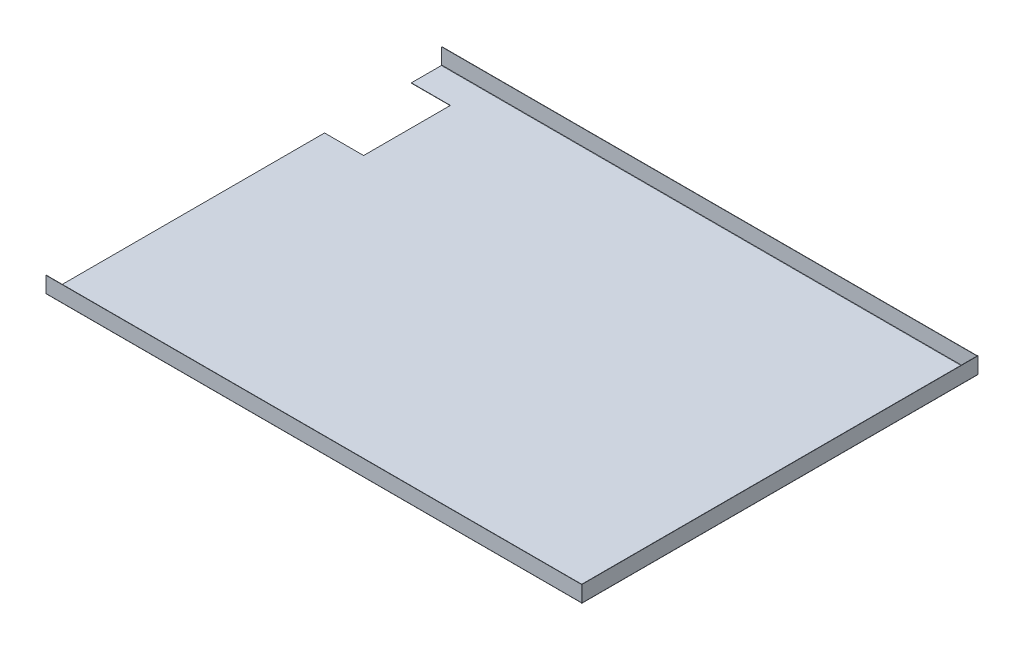
ISO-10303-21;
HEADER;
FILE_DESCRIPTION(('STEP AP214'),'2;1');
FILE_NAME('part.step','',(''),(''),'','','');
FILE_SCHEMA(('AUTOMOTIVE_DESIGN { 1 0 10303 214 1 1 1 1 }'));
ENDSEC;
DATA;
#1=APPLICATION_CONTEXT('core data for automotive mechanical design processes');
#2=APPLICATION_PROTOCOL_DEFINITION('international standard','automotive_design',2000,#1);
#3=PRODUCT_CONTEXT('',#1,'mechanical');
#4=PRODUCT('Part','Part','',(#3));
#5=PRODUCT_RELATED_PRODUCT_CATEGORY('part','',(#4));
#6=PRODUCT_DEFINITION_FORMATION('','',#4);
#7=PRODUCT_DEFINITION_CONTEXT('part definition',#1,'design');
#8=PRODUCT_DEFINITION('design','',#6,#7);
#9=PRODUCT_DEFINITION_SHAPE('','',#8);
#10=(LENGTH_UNIT() NAMED_UNIT(*) SI_UNIT(.MILLI.,.METRE.));
#11=(NAMED_UNIT(*) PLANE_ANGLE_UNIT() SI_UNIT($,.RADIAN.));
#12=(NAMED_UNIT(*) SI_UNIT($,.STERADIAN.) SOLID_ANGLE_UNIT());
#13=UNCERTAINTY_MEASURE_WITH_UNIT(LENGTH_MEASURE(1.E-05),#10,'distance_accuracy_value','');
#14=(GEOMETRIC_REPRESENTATION_CONTEXT(3) GLOBAL_UNCERTAINTY_ASSIGNED_CONTEXT((#13)) GLOBAL_UNIT_ASSIGNED_CONTEXT((#10,
#11,#12)) REPRESENTATION_CONTEXT('',''));
#15=CARTESIAN_POINT('',(0.,0.,0.));
#16=DIRECTION('',(0.,0.,1.));
#17=DIRECTION('',(1.,0.,0.));
#18=AXIS2_PLACEMENT_3D('',#15,#16,#17);
#19=CARTESIAN_POINT('',(0.,-0.127,170.));
#20=DIRECTION('',(-1.,0.,0.));
#21=DIRECTION('',(0.,0.,1.));
#22=AXIS2_PLACEMENT_3D('',#19,#20,#21);
#23=PLANE('',#22);
#24=DIRECTION('',(0.,-1.,0.));
#25=VECTOR('',#24,1.);
#26=CARTESIAN_POINT('',(0.,-0.127,13.1455344277034));
#27=LINE('',#26,#25);
#28=CARTESIAN_POINT('',(0.,0.,13.1455344277034));
#29=VERTEX_POINT('',#28);
#30=CARTESIAN_POINT('',(0.,-0.127,13.1455344277034));
#31=VERTEX_POINT('',#30);
#32=EDGE_CURVE('E85',#29,#31,#27,.T.);
#33=ORIENTED_EDGE('',*,*,#32,.F.);
#34=DIRECTION('',(0.,0.,-1.));
#35=VECTOR('',#34,1.);
#36=CARTESIAN_POINT('',(0.,0.,170.));
#37=LINE('',#36,#35);
#38=CARTESIAN_POINT('',(0.,0.,0.254));
#39=VERTEX_POINT('',#38);
#40=EDGE_CURVE('E257',#29,#39,#37,.T.);
#41=ORIENTED_EDGE('',*,*,#40,.T.);
#42=DIRECTION('',(0.,-1.,0.));
#43=VECTOR('',#42,1.);
#44=CARTESIAN_POINT('',(0.,0.,0.254));
#45=LINE('',#44,#43);
#46=CARTESIAN_POINT('',(0.,-0.127,0.254));
#47=VERTEX_POINT('',#46);
#48=EDGE_CURVE('E298',#39,#47,#45,.T.);
#49=ORIENTED_EDGE('',*,*,#48,.T.);
#50=DIRECTION('',(0.,0.,-1.));
#51=VECTOR('',#50,1.);
#52=CARTESIAN_POINT('',(0.,-0.127,170.));
#53=LINE('',#52,#51);
#54=EDGE_CURVE('E293',#31,#47,#53,.T.);
#55=ORIENTED_EDGE('',*,*,#54,.F.);
#56=EDGE_LOOP('',(#33,#41,#49,#55));
#57=FACE_BOUND('',#56,.T.);
#58=ADVANCED_FACE('F77',(#57),#23,.T.);
#59=CARTESIAN_POINT('',(229.873,0.,170.));
#60=DIRECTION('',(-1.,0.,0.));
#61=DIRECTION('',(0.,0.,1.));
#62=AXIS2_PLACEMENT_3D('',#59,#60,#61);
#63=PLANE('',#62);
#64=DIRECTION('',(0.,0.,-1.));
#65=VECTOR('',#64,1.);
#66=CARTESIAN_POINT('',(229.873,0.,170.));
#67=LINE('',#66,#65);
#68=CARTESIAN_POINT('',(229.873,0.,170.));
#69=VERTEX_POINT('',#68);
#70=CARTESIAN_POINT('',(229.873,0.,169.965970452561));
#71=VERTEX_POINT('',#70);
#72=EDGE_CURVE('E260',#69,#71,#67,.T.);
#73=ORIENTED_EDGE('',*,*,#72,.T.);
#74=CARTESIAN_POINT('',(229.873,0.126999999999988,169.746));
#75=DIRECTION('',(1.,0.,0.));
#76=DIRECTION('',(0.,0.,-1.));
#77=AXIS2_PLACEMENT_3D('',#74,#75,#76);
#78=CIRCLE('',#77,0.253999999999988);
#79=CARTESIAN_POINT('',(229.873,-0.127,169.746));
#80=VERTEX_POINT('',#79);
#81=EDGE_CURVE('E241',#71,#80,#78,.T.);
#82=ORIENTED_EDGE('',*,*,#81,.T.);
#83=DIRECTION('',(0.,0.,-1.));
#84=VECTOR('',#83,1.);
#85=CARTESIAN_POINT('',(229.873,-0.127,170.));
#86=LINE('',#85,#84);
#87=CARTESIAN_POINT('',(229.873,-0.127,170.));
#88=VERTEX_POINT('',#87);
#89=EDGE_CURVE('E300',#88,#80,#86,.T.);
#90=ORIENTED_EDGE('',*,*,#89,.F.);
#91=DIRECTION('',(0.,1.,0.));
#92=VECTOR('',#91,1.);
#93=CARTESIAN_POINT('',(229.873,-0.127,170.));
#94=LINE('',#93,#92);
#95=EDGE_CURVE('E276',#88,#69,#94,.T.);
#96=ORIENTED_EDGE('',*,*,#95,.T.);
#97=EDGE_LOOP('',(#73,#82,#90,#96));
#98=FACE_BOUND('',#97,.T.);
#99=ADVANCED_FACE('F513',(#98),#63,.T.);
#100=CARTESIAN_POINT('',(229.873,0.,0.254));
#101=DIRECTION('',(-1.,0.,0.));
#102=DIRECTION('',(0.,0.,1.));
#103=AXIS2_PLACEMENT_3D('',#100,#101,#102);
#104=PLANE('',#103);
#105=CARTESIAN_POINT('',(229.873,-0.127,0.254));
#106=VERTEX_POINT('',#105);
#107=CARTESIAN_POINT('',(229.873,-0.127,0.));
#108=VERTEX_POINT('',#107);
#109=EDGE_CURVE('E303',#106,#108,#86,.T.);
#110=ORIENTED_EDGE('',*,*,#109,.F.);
#111=CARTESIAN_POINT('',(229.873,0.126999999999999,0.254));
#112=DIRECTION('',(-1.,0.,0.));
#113=DIRECTION('',(0.,0.,1.));
#114=AXIS2_PLACEMENT_3D('',#111,#112,#113);
#115=CIRCLE('',#114,0.254);
#116=CARTESIAN_POINT('',(229.873,0.,0.0340295474387515));
#117=VERTEX_POINT('',#116);
#118=EDGE_CURVE('E353',#106,#117,#115,.F.);
#119=ORIENTED_EDGE('',*,*,#118,.T.);
#120=DIRECTION('',(0.,0.,-1.));
#121=VECTOR('',#120,1.);
#122=CARTESIAN_POINT('',(229.873,0.,0.254));
#123=LINE('',#122,#121);
#124=CARTESIAN_POINT('',(229.873,0.,0.));
#125=VERTEX_POINT('',#124);
#126=EDGE_CURVE('E351',#117,#125,#123,.T.);
#127=ORIENTED_EDGE('',*,*,#126,.T.);
#128=DIRECTION('',(0.,-1.,0.));
#129=VECTOR('',#128,1.);
#130=CARTESIAN_POINT('',(229.873,0.,0.));
#131=LINE('',#130,#129);
#132=EDGE_CURVE('E274',#125,#108,#131,.T.);
#133=ORIENTED_EDGE('',*,*,#132,.T.);
#134=EDGE_LOOP('',(#110,#119,#127,#133));
#135=FACE_BOUND('',#134,.T.);
#136=ADVANCED_FACE('F492',(#135),#104,.T.);
#137=CARTESIAN_POINT('',(0.,0.,170.));
#138=DIRECTION('',(0.,1.,0.));
#139=DIRECTION('',(0.,0.,1.));
#140=AXIS2_PLACEMENT_3D('',#137,#138,#139);
#141=PLANE('',#140);
#142=DIRECTION('',(-1.,0.,0.));
#143=VECTOR('',#142,1.);
#144=CARTESIAN_POINT('',(0.,0.,13.1455344277034));
#145=LINE('',#144,#143);
#146=CARTESIAN_POINT('',(16.773112734168,0.,13.1455344277034));
#147=VERTEX_POINT('',#146);
#148=EDGE_CURVE('E286',#147,#29,#145,.T.);
#149=ORIENTED_EDGE('',*,*,#148,.F.);
#150=DIRECTION('',(0.,0.,-1.));
#151=VECTOR('',#150,1.);
#152=CARTESIAN_POINT('',(16.773112734168,0.,13.1455344277034));
#153=LINE('',#152,#151);
#154=CARTESIAN_POINT('',(16.773112734168,0.,50.4120319692511));
#155=VERTEX_POINT('',#154);
#156=EDGE_CURVE('E251',#155,#147,#153,.T.);
#157=ORIENTED_EDGE('',*,*,#156,.F.);
#158=DIRECTION('',(1.,0.,0.));
#159=VECTOR('',#158,1.);
#160=CARTESIAN_POINT('',(16.773112734168,0.,50.4120319692511));
#161=LINE('',#160,#159);
#162=CARTESIAN_POINT('',(0.,0.,50.4120319692511));
#163=VERTEX_POINT('',#162);
#164=EDGE_CURVE('E235',#163,#155,#161,.T.);
#165=ORIENTED_EDGE('',*,*,#164,.F.);
#166=CARTESIAN_POINT('',(0.,0.,169.746));
#167=VERTEX_POINT('',#166);
#168=EDGE_CURVE('E248',#167,#163,#37,.T.);
#169=ORIENTED_EDGE('',*,*,#168,.F.);
#170=DIRECTION('',(1.,0.,0.));
#171=VECTOR('',#170,1.);
#172=CARTESIAN_POINT('',(229.873,0.,169.746));
#173=LINE('',#172,#171);
#174=CARTESIAN_POINT('',(229.873,0.,169.746));
#175=VERTEX_POINT('',#174);
#176=EDGE_CURVE('E407',#175,#167,#173,.F.);
#177=ORIENTED_EDGE('',*,*,#176,.F.);
#178=CARTESIAN_POINT('',(229.873,0.,0.254));
#179=VERTEX_POINT('',#178);
#180=EDGE_CURVE('E256',#175,#179,#67,.T.);
#181=ORIENTED_EDGE('',*,*,#180,.T.);
#182=DIRECTION('',(-1.,0.,0.));
#183=VECTOR('',#182,1.);
#184=CARTESIAN_POINT('',(0.,0.,0.254));
#185=LINE('',#184,#183);
#186=EDGE_CURVE('E357',#39,#179,#185,.F.);
#187=ORIENTED_EDGE('',*,*,#186,.F.);
#188=ORIENTED_EDGE('',*,*,#40,.F.);
#189=EDGE_LOOP('',(#149,#157,#165,#169,#177,#181,#187,#188));
#190=FACE_BOUND('',#189,.T.);
#191=ADVANCED_FACE('F246',(#190),#141,.T.);
#192=CARTESIAN_POINT('',(0.,-0.127,170.));
#193=DIRECTION('',(0.,1.,0.));
#194=DIRECTION('',(0.,0.,1.));
#195=AXIS2_PLACEMENT_3D('',#192,#193,#194);
#196=PLANE('',#195);
#197=DIRECTION('',(0.,0.,-1.));
#198=VECTOR('',#197,1.);
#199=CARTESIAN_POINT('',(16.773112734168,-0.127,170.));
#200=LINE('',#199,#198);
#201=CARTESIAN_POINT('',(16.773112734168,-0.127,50.4120319692511));
#202=VERTEX_POINT('',#201);
#203=CARTESIAN_POINT('',(16.773112734168,-0.127,13.1455344277034));
#204=VERTEX_POINT('',#203);
#205=EDGE_CURVE('E13',#202,#204,#200,.T.);
#206=ORIENTED_EDGE('',*,*,#205,.T.);
#207=DIRECTION('',(-1.,0.,0.));
#208=VECTOR('',#207,1.);
#209=CARTESIAN_POINT('',(0.,-0.127,13.1455344277034));
#210=LINE('',#209,#208);
#211=EDGE_CURVE('E284',#204,#31,#210,.T.);
#212=ORIENTED_EDGE('',*,*,#211,.T.);
#213=ORIENTED_EDGE('',*,*,#54,.T.);
#214=DIRECTION('',(-1.,0.,0.));
#215=VECTOR('',#214,1.);
#216=CARTESIAN_POINT('',(0.,-0.127000000000001,0.254));
#217=LINE('',#216,#215);
#218=EDGE_CURVE('E367',#47,#106,#217,.F.);
#219=ORIENTED_EDGE('',*,*,#218,.T.);
#220=EDGE_CURVE('E302',#80,#106,#86,.T.);
#221=ORIENTED_EDGE('',*,*,#220,.F.);
#222=DIRECTION('',(1.,0.,0.));
#223=VECTOR('',#222,1.);
#224=CARTESIAN_POINT('',(229.873,-0.127,169.746));
#225=LINE('',#224,#223);
#226=CARTESIAN_POINT('',(0.,-0.127,169.746));
#227=VERTEX_POINT('',#226);
#228=EDGE_CURVE('E416',#80,#227,#225,.F.);
#229=ORIENTED_EDGE('',*,*,#228,.T.);
#230=CARTESIAN_POINT('',(0.,-0.127,50.4120319692511));
#231=VERTEX_POINT('',#230);
#232=EDGE_CURVE('E261',#227,#231,#53,.T.);
#233=ORIENTED_EDGE('',*,*,#232,.T.);
#234=DIRECTION('',(1.,0.,0.));
#235=VECTOR('',#234,1.);
#236=CARTESIAN_POINT('',(0.,-0.127,50.4120319692511));
#237=LINE('',#236,#235);
#238=EDGE_CURVE('E92',#231,#202,#237,.T.);
#239=ORIENTED_EDGE('',*,*,#238,.T.);
#240=EDGE_LOOP('',(#206,#212,#213,#219,#221,#229,#233,#239));
#241=FACE_BOUND('',#240,.T.);
#242=ADVANCED_FACE('F291',(#241),#196,.F.);
#243=DIRECTION('',(0.,1.,0.));
#244=VECTOR('',#243,1.);
#245=CARTESIAN_POINT('',(0.,-0.127,50.4120319692511));
#246=LINE('',#245,#244);
#247=EDGE_CURVE('E232',#231,#163,#246,.T.);
#248=ORIENTED_EDGE('',*,*,#247,.F.);
#249=ORIENTED_EDGE('',*,*,#232,.F.);
#250=DIRECTION('',(0.,-1.,0.));
#251=VECTOR('',#250,1.);
#252=CARTESIAN_POINT('',(0.,0.,169.746));
#253=LINE('',#252,#251);
#254=EDGE_CURVE('E255',#167,#227,#253,.T.);
#255=ORIENTED_EDGE('',*,*,#254,.F.);
#256=ORIENTED_EDGE('',*,*,#168,.T.);
#257=EDGE_LOOP('',(#248,#249,#255,#256));
#258=FACE_BOUND('',#257,.T.);
#259=ADVANCED_FACE('F253',(#258),#23,.T.);
#260=CARTESIAN_POINT('',(230.,0.127,170.));
#261=DIRECTION('',(0.,0.,1.));
#262=DIRECTION('',(1.,0.,0.));
#263=AXIS2_PLACEMENT_3D('',#260,#261,#262);
#264=PLANE('',#263);
#265=DIRECTION('',(1.,0.,0.));
#266=VECTOR('',#265,1.);
#267=CARTESIAN_POINT('',(230.,0.127,170.));
#268=LINE('',#267,#266);
#269=CARTESIAN_POINT('',(230.,0.127,170.));
#270=VERTEX_POINT('',#269);
#271=CARTESIAN_POINT('',(230.127,0.127,170.));
#272=VERTEX_POINT('',#271);
#273=EDGE_CURVE('E279',#270,#272,#268,.T.);
#274=ORIENTED_EDGE('',*,*,#273,.F.);
#275=CARTESIAN_POINT('',(229.873,0.127,170.));
#276=DIRECTION('',(0.,0.,-1.));
#277=DIRECTION('',(-1.,0.,0.));
#278=AXIS2_PLACEMENT_3D('',#275,#276,#277);
#279=CIRCLE('',#278,0.127);
#280=EDGE_CURVE('E322',#69,#270,#279,.F.);
#281=ORIENTED_EDGE('',*,*,#280,.F.);
#282=ORIENTED_EDGE('',*,*,#95,.F.);
#283=CARTESIAN_POINT('',(229.873,0.127,170.));
#284=DIRECTION('',(0.,0.,1.));
#285=DIRECTION('',(1.,0.,0.));
#286=AXIS2_PLACEMENT_3D('',#283,#284,#285);
#287=CIRCLE('',#286,0.254);
#288=EDGE_CURVE('E315',#88,#272,#287,.T.);
#289=ORIENTED_EDGE('',*,*,#288,.T.);
#290=EDGE_LOOP('',(#274,#281,#282,#289));
#291=FACE_BOUND('',#290,.T.);
#292=ADVANCED_FACE('F79',(#291),#264,.T.);
#293=CARTESIAN_POINT('',(229.873,-0.127,170.));
#294=DIRECTION('',(0.,0.,1.));
#295=DIRECTION('',(1.,0.,0.));
#296=AXIS2_PLACEMENT_3D('',#293,#294,#295);
#297=PLANE('',#296);
#298=DIRECTION('',(0.,1.,0.));
#299=VECTOR('',#298,1.);
#300=CARTESIAN_POINT('',(230.,0.,170.));
#301=LINE('',#300,#299);
#302=CARTESIAN_POINT('',(230.,7.,170.));
#303=VERTEX_POINT('',#302);
#304=EDGE_CURVE('E342',#270,#303,#301,.T.);
#305=ORIENTED_EDGE('',*,*,#304,.F.);
#306=ORIENTED_EDGE('',*,*,#273,.T.);
#307=DIRECTION('',(0.,1.,0.));
#308=VECTOR('',#307,1.);
#309=CARTESIAN_POINT('',(230.127,0.,170.));
#310=LINE('',#309,#308);
#311=CARTESIAN_POINT('',(230.127,7.,170.));
#312=VERTEX_POINT('',#311);
#313=EDGE_CURVE('E327',#272,#312,#310,.T.);
#314=ORIENTED_EDGE('',*,*,#313,.T.);
#315=DIRECTION('',(1.,0.,0.));
#316=VECTOR('',#315,1.);
#317=CARTESIAN_POINT('',(230.,7.,170.));
#318=LINE('',#317,#316);
#319=EDGE_CURVE('E345',#303,#312,#318,.T.);
#320=ORIENTED_EDGE('',*,*,#319,.F.);
#321=EDGE_LOOP('',(#305,#306,#314,#320));
#322=FACE_BOUND('',#321,.T.);
#323=ADVANCED_FACE('F510',(#322),#297,.T.);
#324=CARTESIAN_POINT('',(229.873,0.,0.));
#325=DIRECTION('',(0.,0.,-1.));
#326=DIRECTION('',(-1.,0.,0.));
#327=AXIS2_PLACEMENT_3D('',#324,#325,#326);
#328=PLANE('',#327);
#329=ORIENTED_EDGE('',*,*,#132,.F.);
#330=CARTESIAN_POINT('',(229.873,0.127,0.));
#331=DIRECTION('',(0.,0.,-1.));
#332=DIRECTION('',(-1.,0.,0.));
#333=AXIS2_PLACEMENT_3D('',#330,#331,#332);
#334=CIRCLE('',#333,0.127);
#335=CARTESIAN_POINT('',(230.,0.127,0.));
#336=VERTEX_POINT('',#335);
#337=EDGE_CURVE('E328',#125,#336,#334,.F.);
#338=ORIENTED_EDGE('',*,*,#337,.T.);
#339=DIRECTION('',(-1.,0.,0.));
#340=VECTOR('',#339,1.);
#341=CARTESIAN_POINT('',(230.127,0.127,0.));
#342=LINE('',#341,#340);
#343=CARTESIAN_POINT('',(230.127,0.127,0.));
#344=VERTEX_POINT('',#343);
#345=EDGE_CURVE('E272',#344,#336,#342,.T.);
#346=ORIENTED_EDGE('',*,*,#345,.F.);
#347=CARTESIAN_POINT('',(229.873,0.127,0.));
#348=DIRECTION('',(0.,0.,1.));
#349=DIRECTION('',(1.,0.,0.));
#350=AXIS2_PLACEMENT_3D('',#347,#348,#349);
#351=CIRCLE('',#350,0.254);
#352=EDGE_CURVE('E325',#108,#344,#351,.T.);
#353=ORIENTED_EDGE('',*,*,#352,.F.);
#354=EDGE_LOOP('',(#329,#338,#346,#353));
#355=FACE_BOUND('',#354,.T.);
#356=ADVANCED_FACE('F496',(#355),#328,.T.);
#357=CARTESIAN_POINT('',(230.127,0.,170.));
#358=DIRECTION('',(-1.,0.,0.));
#359=DIRECTION('',(0.,0.,1.));
#360=AXIS2_PLACEMENT_3D('',#357,#358,#359);
#361=PLANE('',#360);
#362=DIRECTION('',(0.,1.,0.));
#363=VECTOR('',#362,1.);
#364=CARTESIAN_POINT('',(230.127,0.,0.));
#365=LINE('',#364,#363);
#366=CARTESIAN_POINT('',(230.127,7.,0.));
#367=VERTEX_POINT('',#366);
#368=EDGE_CURVE('E337',#344,#367,#365,.T.);
#369=ORIENTED_EDGE('',*,*,#368,.T.);
#370=DIRECTION('',(0.,0.,-1.));
#371=VECTOR('',#370,1.);
#372=CARTESIAN_POINT('',(230.127,7.,170.));
#373=LINE('',#372,#371);
#374=EDGE_CURVE('E270',#312,#367,#373,.T.);
#375=ORIENTED_EDGE('',*,*,#374,.F.);
#376=ORIENTED_EDGE('',*,*,#313,.F.);
#377=DIRECTION('',(0.,0.,-1.));
#378=VECTOR('',#377,1.);
#379=CARTESIAN_POINT('',(230.127,0.127,170.));
#380=LINE('',#379,#378);
#381=EDGE_CURVE('E310',#272,#344,#380,.T.);
#382=ORIENTED_EDGE('',*,*,#381,.T.);
#383=EDGE_LOOP('',(#369,#375,#376,#382));
#384=FACE_BOUND('',#383,.T.);
#385=ADVANCED_FACE('F507',(#384),#361,.F.);
#386=CARTESIAN_POINT('',(230.,7.,170.));
#387=DIRECTION('',(0.,1.,0.));
#388=DIRECTION('',(0.,0.,1.));
#389=AXIS2_PLACEMENT_3D('',#386,#387,#388);
#390=PLANE('',#389);
#391=DIRECTION('',(1.,0.,0.));
#392=VECTOR('',#391,1.);
#393=CARTESIAN_POINT('',(230.,7.,0.));
#394=LINE('',#393,#392);
#395=CARTESIAN_POINT('',(230.,7.,0.));
#396=VERTEX_POINT('',#395);
#397=EDGE_CURVE('E334',#396,#367,#394,.T.);
#398=ORIENTED_EDGE('',*,*,#397,.F.);
#399=DIRECTION('',(0.,0.,-1.));
#400=VECTOR('',#399,1.);
#401=CARTESIAN_POINT('',(230.,7.,170.));
#402=LINE('',#401,#400);
#403=EDGE_CURVE('E268',#303,#396,#402,.T.);
#404=ORIENTED_EDGE('',*,*,#403,.F.);
#405=ORIENTED_EDGE('',*,*,#319,.T.);
#406=ORIENTED_EDGE('',*,*,#374,.T.);
#407=EDGE_LOOP('',(#398,#404,#405,#406));
#408=FACE_BOUND('',#407,.T.);
#409=ADVANCED_FACE('F868',(#408),#390,.T.);
#410=CARTESIAN_POINT('',(230.,0.,170.));
#411=DIRECTION('',(-1.,0.,0.));
#412=DIRECTION('',(0.,0.,1.));
#413=AXIS2_PLACEMENT_3D('',#410,#411,#412);
#414=PLANE('',#413);
#415=DIRECTION('',(0.,1.,0.));
#416=VECTOR('',#415,1.);
#417=CARTESIAN_POINT('',(230.,0.,0.));
#418=LINE('',#417,#416);
#419=EDGE_CURVE('E331',#336,#396,#418,.T.);
#420=ORIENTED_EDGE('',*,*,#419,.F.);
#421=DIRECTION('',(0.,0.,-1.));
#422=VECTOR('',#421,1.);
#423=CARTESIAN_POINT('',(230.,0.127,170.));
#424=LINE('',#423,#422);
#425=EDGE_CURVE('E265',#270,#336,#424,.T.);
#426=ORIENTED_EDGE('',*,*,#425,.F.);
#427=ORIENTED_EDGE('',*,*,#304,.T.);
#428=ORIENTED_EDGE('',*,*,#403,.T.);
#429=EDGE_LOOP('',(#420,#426,#427,#428));
#430=FACE_BOUND('',#429,.T.);
#431=ADVANCED_FACE('F502',(#430),#414,.T.);
#432=CARTESIAN_POINT('',(229.873,0.127,170.));
#433=DIRECTION('',(0.,0.,-1.));
#434=DIRECTION('',(-1.,0.,0.));
#435=AXIS2_PLACEMENT_3D('',#432,#433,#434);
#436=CYLINDRICAL_SURFACE('',#435,0.127);
#437=ORIENTED_EDGE('',*,*,#337,.F.);
#438=ORIENTED_EDGE('',*,*,#126,.F.);
#439=EDGE_CURVE('E338',#179,#117,#123,.T.);
#440=ORIENTED_EDGE('',*,*,#439,.F.);
#441=ORIENTED_EDGE('',*,*,#180,.F.);
#442=EDGE_CURVE('E100',#71,#175,#67,.T.);
#443=ORIENTED_EDGE('',*,*,#442,.F.);
#444=ORIENTED_EDGE('',*,*,#72,.F.);
#445=ORIENTED_EDGE('',*,*,#280,.T.);
#446=ORIENTED_EDGE('',*,*,#425,.T.);
#447=EDGE_LOOP('',(#437,#438,#440,#441,#443,#444,#445,#446));
#448=FACE_BOUND('',#447,.T.);
#449=ADVANCED_FACE('F497',(#448),#436,.F.);
#450=CARTESIAN_POINT('',(229.873,0.127,170.));
#451=DIRECTION('',(0.,0.,-1.));
#452=DIRECTION('',(-1.,0.,0.));
#453=AXIS2_PLACEMENT_3D('',#450,#451,#452);
#454=CYLINDRICAL_SURFACE('',#453,0.254);
#455=ORIENTED_EDGE('',*,*,#352,.T.);
#456=ORIENTED_EDGE('',*,*,#381,.F.);
#457=ORIENTED_EDGE('',*,*,#288,.F.);
#458=ORIENTED_EDGE('',*,*,#89,.T.);
#459=ORIENTED_EDGE('',*,*,#220,.T.);
#460=ORIENTED_EDGE('',*,*,#109,.T.);
#461=EDGE_LOOP('',(#455,#456,#457,#458,#459,#460));
#462=FACE_BOUND('',#461,.T.);
#463=ADVANCED_FACE('F490',(#462),#454,.T.);
#464=CARTESIAN_POINT('',(229.873,0.127,0.));
#465=DIRECTION('',(0.,0.,-1.));
#466=DIRECTION('',(-1.,0.,0.));
#467=AXIS2_PLACEMENT_3D('',#464,#465,#466);
#468=PLANE('',#467);
#469=ORIENTED_EDGE('',*,*,#368,.F.);
#470=ORIENTED_EDGE('',*,*,#345,.T.);
#471=ORIENTED_EDGE('',*,*,#419,.T.);
#472=ORIENTED_EDGE('',*,*,#397,.T.);
#473=EDGE_LOOP('',(#469,#470,#471,#472));
#474=FACE_BOUND('',#473,.T.);
#475=ADVANCED_FACE('F505',(#474),#468,.T.);
#476=CARTESIAN_POINT('',(229.873,0.126999999999999,0.254));
#477=DIRECTION('',(1.,0.,0.));
#478=DIRECTION('',(0.,0.,-1.));
#479=AXIS2_PLACEMENT_3D('',#476,#477,#478);
#480=PLANE('',#479);
#481=CARTESIAN_POINT('',(229.873,0.126999999999999,0.254));
#482=DIRECTION('',(-1.,0.,0.));
#483=DIRECTION('',(0.,0.,1.));
#484=AXIS2_PLACEMENT_3D('',#481,#482,#483);
#485=CIRCLE('',#484,0.127);
#486=CARTESIAN_POINT('',(229.873,0.126999999999998,0.127));
#487=VERTEX_POINT('',#486);
#488=EDGE_CURVE('E361',#179,#487,#485,.F.);
#489=ORIENTED_EDGE('',*,*,#488,.F.);
#490=ORIENTED_EDGE('',*,*,#439,.T.);
#491=CARTESIAN_POINT('',(229.873,0.126999999999998,0.));
#492=VERTEX_POINT('',#491);
#493=EDGE_CURVE('E370',#117,#492,#115,.F.);
#494=ORIENTED_EDGE('',*,*,#493,.T.);
#495=DIRECTION('',(0.,0.,1.));
#496=VECTOR('',#495,1.);
#497=CARTESIAN_POINT('',(229.873,0.127,0.));
#498=LINE('',#497,#496);
#499=EDGE_CURVE('E372',#487,#492,#498,.F.);
#500=ORIENTED_EDGE('',*,*,#499,.F.);
#501=EDGE_LOOP('',(#489,#490,#494,#500));
#502=FACE_BOUND('',#501,.T.);
#503=ADVANCED_FACE('F576',(#502),#480,.T.);
#504=CARTESIAN_POINT('',(0.,0.126999999999999,0.254));
#505=DIRECTION('',(1.,0.,0.));
#506=DIRECTION('',(0.,0.,-1.));
#507=AXIS2_PLACEMENT_3D('',#504,#505,#506);
#508=PLANE('',#507);
#509=CARTESIAN_POINT('',(0.,0.126999999999999,0.254));
#510=DIRECTION('',(-1.,0.,0.));
#511=DIRECTION('',(0.,0.,1.));
#512=AXIS2_PLACEMENT_3D('',#509,#510,#511);
#513=CIRCLE('',#512,0.127);
#514=CARTESIAN_POINT('',(0.,0.126999999999998,0.127));
#515=VERTEX_POINT('',#514);
#516=EDGE_CURVE('E354',#515,#39,#513,.T.);
#517=ORIENTED_EDGE('',*,*,#516,.F.);
#518=DIRECTION('',(0.,0.,1.));
#519=VECTOR('',#518,1.);
#520=CARTESIAN_POINT('',(0.,0.127,0.127));
#521=LINE('',#520,#519);
#522=CARTESIAN_POINT('',(0.,0.127,0.));
#523=VERTEX_POINT('',#522);
#524=EDGE_CURVE('E377',#515,#523,#521,.F.);
#525=ORIENTED_EDGE('',*,*,#524,.T.);
#526=CARTESIAN_POINT('',(0.,0.126999999999999,0.254));
#527=DIRECTION('',(-1.,0.,0.));
#528=DIRECTION('',(0.,0.,1.));
#529=AXIS2_PLACEMENT_3D('',#526,#527,#528);
#530=CIRCLE('',#529,0.254);
#531=EDGE_CURVE('E364',#523,#47,#530,.T.);
#532=ORIENTED_EDGE('',*,*,#531,.T.);
#533=ORIENTED_EDGE('',*,*,#48,.F.);
#534=EDGE_LOOP('',(#517,#525,#532,#533));
#535=FACE_BOUND('',#534,.T.);
#536=ADVANCED_FACE('F462',(#535),#508,.F.);
#537=CARTESIAN_POINT('',(0.,0.126999999999999,0.254));
#538=DIRECTION('',(-1.,0.,0.));
#539=DIRECTION('',(0.,0.,-1.));
#540=AXIS2_PLACEMENT_3D('',#537,#538,#539);
#541=CYLINDRICAL_SURFACE('',#540,0.254);
#542=ORIENTED_EDGE('',*,*,#218,.F.);
#543=ORIENTED_EDGE('',*,*,#531,.F.);
#544=DIRECTION('',(-1.,0.,0.));
#545=VECTOR('',#544,1.);
#546=CARTESIAN_POINT('',(229.873,0.127,0.));
#547=LINE('',#546,#545);
#548=EDGE_CURVE('E380',#523,#492,#547,.F.);
#549=ORIENTED_EDGE('',*,*,#548,.T.);
#550=ORIENTED_EDGE('',*,*,#493,.F.);
#551=ORIENTED_EDGE('',*,*,#118,.F.);
#552=EDGE_LOOP('',(#542,#543,#549,#550,#551));
#553=FACE_BOUND('',#552,.T.);
#554=ADVANCED_FACE('F487',(#553),#541,.T.);
#555=CARTESIAN_POINT('',(0.,0.126999999999999,0.254));
#556=DIRECTION('',(-1.,0.,0.));
#557=DIRECTION('',(0.,0.,-1.));
#558=AXIS2_PLACEMENT_3D('',#555,#556,#557);
#559=CYLINDRICAL_SURFACE('',#558,0.127);
#560=ORIENTED_EDGE('',*,*,#186,.T.);
#561=ORIENTED_EDGE('',*,*,#488,.T.);
#562=DIRECTION('',(-1.,0.,0.));
#563=VECTOR('',#562,1.);
#564=CARTESIAN_POINT('',(229.873,0.127,0.127));
#565=LINE('',#564,#563);
#566=EDGE_CURVE('E375',#487,#515,#565,.T.);
#567=ORIENTED_EDGE('',*,*,#566,.T.);
#568=ORIENTED_EDGE('',*,*,#516,.T.);
#569=EDGE_LOOP('',(#560,#561,#567,#568));
#570=FACE_BOUND('',#569,.T.);
#571=ADVANCED_FACE('F464',(#570),#559,.F.);
#572=CARTESIAN_POINT('',(0.,6.873,0.));
#573=DIRECTION('',(1.,0.,0.));
#574=DIRECTION('',(0.,0.,-1.));
#575=AXIS2_PLACEMENT_3D('',#572,#573,#574);
#576=PLANE('',#575);
#577=ORIENTED_EDGE('',*,*,#524,.F.);
#578=DIRECTION('',(0.,-1.,0.));
#579=VECTOR('',#578,1.);
#580=CARTESIAN_POINT('',(0.,6.873,0.126999999999976));
#581=LINE('',#580,#579);
#582=CARTESIAN_POINT('',(0.,6.873,0.126999999999976));
#583=VERTEX_POINT('',#582);
#584=EDGE_CURVE('E383',#515,#583,#581,.F.);
#585=ORIENTED_EDGE('',*,*,#584,.T.);
#586=DIRECTION('',(0.,0.,1.));
#587=VECTOR('',#586,1.);
#588=CARTESIAN_POINT('',(0.,6.873,0.));
#589=LINE('',#588,#587);
#590=CARTESIAN_POINT('',(0.,6.873,0.));
#591=VERTEX_POINT('',#590);
#592=EDGE_CURVE('E358',#591,#583,#589,.T.);
#593=ORIENTED_EDGE('',*,*,#592,.F.);
#594=DIRECTION('',(0.,1.,0.));
#595=VECTOR('',#594,1.);
#596=CARTESIAN_POINT('',(0.,0.,0.));
#597=LINE('',#596,#595);
#598=EDGE_CURVE('E390',#523,#591,#597,.T.);
#599=ORIENTED_EDGE('',*,*,#598,.F.);
#600=EDGE_LOOP('',(#577,#585,#593,#599));
#601=FACE_BOUND('',#600,.T.);
#602=ADVANCED_FACE('F481',(#601),#576,.F.);
#603=CARTESIAN_POINT('',(229.873,0.,0.));
#604=DIRECTION('',(-1.,0.,0.));
#605=DIRECTION('',(0.,0.,1.));
#606=AXIS2_PLACEMENT_3D('',#603,#604,#605);
#607=PLANE('',#606);
#608=ORIENTED_EDGE('',*,*,#499,.T.);
#609=DIRECTION('',(0.,-1.,0.));
#610=VECTOR('',#609,1.);
#611=CARTESIAN_POINT('',(229.873,0.,0.));
#612=LINE('',#611,#610);
#613=CARTESIAN_POINT('',(229.873,6.873,0.));
#614=VERTEX_POINT('',#613);
#615=EDGE_CURVE('E394',#614,#492,#612,.T.);
#616=ORIENTED_EDGE('',*,*,#615,.F.);
#617=DIRECTION('',(0.,0.,1.));
#618=VECTOR('',#617,1.);
#619=CARTESIAN_POINT('',(229.873,6.873,0.));
#620=LINE('',#619,#618);
#621=CARTESIAN_POINT('',(229.873,6.873,0.126999999999976));
#622=VERTEX_POINT('',#621);
#623=EDGE_CURVE('E397',#614,#622,#620,.T.);
#624=ORIENTED_EDGE('',*,*,#623,.T.);
#625=DIRECTION('',(0.,1.,0.));
#626=VECTOR('',#625,1.);
#627=CARTESIAN_POINT('',(229.873,0.,0.127));
#628=LINE('',#627,#626);
#629=EDGE_CURVE('E387',#622,#487,#628,.F.);
#630=ORIENTED_EDGE('',*,*,#629,.T.);
#631=EDGE_LOOP('',(#608,#616,#624,#630));
#632=FACE_BOUND('',#631,.T.);
#633=ADVANCED_FACE('F472',(#632),#607,.F.);
#634=CARTESIAN_POINT('',(0.,0.,0.));
#635=DIRECTION('',(0.,0.,1.));
#636=DIRECTION('',(0.,-1.,0.));
#637=AXIS2_PLACEMENT_3D('',#634,#635,#636);
#638=PLANE('',#637);
#639=ORIENTED_EDGE('',*,*,#548,.F.);
#640=ORIENTED_EDGE('',*,*,#598,.T.);
#641=DIRECTION('',(1.,0.,0.));
#642=VECTOR('',#641,1.);
#643=CARTESIAN_POINT('',(0.,6.873,0.));
#644=LINE('',#643,#642);
#645=EDGE_CURVE('E392',#591,#614,#644,.T.);
#646=ORIENTED_EDGE('',*,*,#645,.T.);
#647=ORIENTED_EDGE('',*,*,#615,.T.);
#648=EDGE_LOOP('',(#639,#640,#646,#647));
#649=FACE_BOUND('',#648,.T.);
#650=ADVANCED_FACE('F484',(#649),#638,.F.);
#651=CARTESIAN_POINT('',(0.,0.,0.127));
#652=DIRECTION('',(0.,0.,1.));
#653=DIRECTION('',(0.,-1.,0.));
#654=AXIS2_PLACEMENT_3D('',#651,#652,#653);
#655=PLANE('',#654);
#656=ORIENTED_EDGE('',*,*,#584,.F.);
#657=ORIENTED_EDGE('',*,*,#566,.F.);
#658=ORIENTED_EDGE('',*,*,#629,.F.);
#659=DIRECTION('',(-1.,0.,0.));
#660=VECTOR('',#659,1.);
#661=CARTESIAN_POINT('',(229.873,6.873,0.126999999999976));
#662=LINE('',#661,#660);
#663=EDGE_CURVE('E385',#583,#622,#662,.F.);
#664=ORIENTED_EDGE('',*,*,#663,.F.);
#665=EDGE_LOOP('',(#656,#657,#658,#664));
#666=FACE_BOUND('',#665,.T.);
#667=ADVANCED_FACE('F469',(#666),#655,.T.);
#668=CARTESIAN_POINT('',(229.873,6.873,0.));
#669=DIRECTION('',(0.,-1.,0.));
#670=DIRECTION('',(0.,0.,-1.));
#671=AXIS2_PLACEMENT_3D('',#668,#669,#670);
#672=PLANE('',#671);
#673=ORIENTED_EDGE('',*,*,#663,.T.);
#674=ORIENTED_EDGE('',*,*,#623,.F.);
#675=ORIENTED_EDGE('',*,*,#645,.F.);
#676=ORIENTED_EDGE('',*,*,#592,.T.);
#677=EDGE_LOOP('',(#673,#674,#675,#676));
#678=FACE_BOUND('',#677,.T.);
#679=ADVANCED_FACE('F477',(#678),#672,.F.);
#680=CARTESIAN_POINT('',(0.,0.126999999999988,169.746));
#681=DIRECTION('',(-1.,0.,0.));
#682=DIRECTION('',(0.,0.,1.));
#683=AXIS2_PLACEMENT_3D('',#680,#681,#682);
#684=PLANE('',#683);
#685=DIRECTION('',(0.,0.,-1.));
#686=VECTOR('',#685,1.);
#687=CARTESIAN_POINT('',(0.,0.126999999999988,170.));
#688=LINE('',#687,#686);
#689=CARTESIAN_POINT('',(0.,0.126999999999988,169.873));
#690=VERTEX_POINT('',#689);
#691=CARTESIAN_POINT('',(0.,0.126999999999988,170.));
#692=VERTEX_POINT('',#691);
#693=EDGE_CURVE('E295',#690,#692,#688,.F.);
#694=ORIENTED_EDGE('',*,*,#693,.F.);
#695=CARTESIAN_POINT('',(0.,0.126999999999988,169.746));
#696=DIRECTION('',(1.,0.,0.));
#697=DIRECTION('',(0.,0.,-1.));
#698=AXIS2_PLACEMENT_3D('',#695,#696,#697);
#699=CIRCLE('',#698,0.126999999999988);
#700=EDGE_CURVE('E410',#167,#690,#699,.F.);
#701=ORIENTED_EDGE('',*,*,#700,.F.);
#702=ORIENTED_EDGE('',*,*,#254,.T.);
#703=CARTESIAN_POINT('',(0.,0.126999999999988,169.746));
#704=DIRECTION('',(1.,0.,0.));
#705=DIRECTION('',(0.,0.,-1.));
#706=AXIS2_PLACEMENT_3D('',#703,#704,#705);
#707=CIRCLE('',#706,0.253999999999988);
#708=EDGE_CURVE('E403',#227,#692,#707,.F.);
#709=ORIENTED_EDGE('',*,*,#708,.T.);
#710=EDGE_LOOP('',(#694,#701,#702,#709));
#711=FACE_BOUND('',#710,.T.);
#712=ADVANCED_FACE('F541',(#711),#684,.T.);
#713=CARTESIAN_POINT('',(229.873,0.126999999999988,169.746));
#714=DIRECTION('',(-1.,0.,0.));
#715=DIRECTION('',(0.,0.,1.));
#716=AXIS2_PLACEMENT_3D('',#713,#714,#715);
#717=PLANE('',#716);
#718=CARTESIAN_POINT('',(229.873,0.126999999999988,170.));
#719=VERTEX_POINT('',#718);
#720=EDGE_CURVE('E413',#719,#71,#78,.T.);
#721=ORIENTED_EDGE('',*,*,#720,.T.);
#722=ORIENTED_EDGE('',*,*,#442,.T.);
#723=CARTESIAN_POINT('',(229.873,0.126999999999988,169.746));
#724=DIRECTION('',(1.,0.,0.));
#725=DIRECTION('',(0.,0.,-1.));
#726=AXIS2_PLACEMENT_3D('',#723,#724,#725);
#727=CIRCLE('',#726,0.126999999999988);
#728=CARTESIAN_POINT('',(229.873,0.126999999999988,169.873));
#729=VERTEX_POINT('',#728);
#730=EDGE_CURVE('E404',#729,#175,#727,.T.);
#731=ORIENTED_EDGE('',*,*,#730,.F.);
#732=DIRECTION('',(0.,0.,-1.));
#733=VECTOR('',#732,1.);
#734=CARTESIAN_POINT('',(229.873,0.126999999999988,169.873));
#735=LINE('',#734,#733);
#736=EDGE_CURVE('E424',#729,#719,#735,.F.);
#737=ORIENTED_EDGE('',*,*,#736,.T.);
#738=EDGE_LOOP('',(#721,#722,#731,#737));
#739=FACE_BOUND('',#738,.T.);
#740=ADVANCED_FACE('F519',(#739),#717,.F.);
#741=CARTESIAN_POINT('',(229.873,0.126999999999988,169.746));
#742=DIRECTION('',(1.,0.,0.));
#743=DIRECTION('',(0.,0.,1.));
#744=AXIS2_PLACEMENT_3D('',#741,#742,#743);
#745=CYLINDRICAL_SURFACE('',#744,0.253999999999988);
#746=ORIENTED_EDGE('',*,*,#228,.F.);
#747=ORIENTED_EDGE('',*,*,#81,.F.);
#748=ORIENTED_EDGE('',*,*,#720,.F.);
#749=DIRECTION('',(1.,0.,0.));
#750=VECTOR('',#749,1.);
#751=CARTESIAN_POINT('',(0.,0.126999999999988,170.));
#752=LINE('',#751,#750);
#753=EDGE_CURVE('E427',#719,#692,#752,.F.);
#754=ORIENTED_EDGE('',*,*,#753,.T.);
#755=ORIENTED_EDGE('',*,*,#708,.F.);
#756=EDGE_LOOP('',(#746,#747,#748,#754,#755));
#757=FACE_BOUND('',#756,.T.);
#758=ADVANCED_FACE('F516',(#757),#745,.T.);
#759=CARTESIAN_POINT('',(229.873,0.126999999999988,169.746));
#760=DIRECTION('',(1.,0.,0.));
#761=DIRECTION('',(0.,0.,1.));
#762=AXIS2_PLACEMENT_3D('',#759,#760,#761);
#763=CYLINDRICAL_SURFACE('',#762,0.126999999999988);
#764=ORIENTED_EDGE('',*,*,#176,.T.);
#765=ORIENTED_EDGE('',*,*,#700,.T.);
#766=DIRECTION('',(1.,0.,0.));
#767=VECTOR('',#766,1.);
#768=CARTESIAN_POINT('',(0.,0.126999999999988,169.873));
#769=LINE('',#768,#767);
#770=EDGE_CURVE('E422',#690,#729,#769,.T.);
#771=ORIENTED_EDGE('',*,*,#770,.T.);
#772=ORIENTED_EDGE('',*,*,#730,.T.);
#773=EDGE_LOOP('',(#764,#765,#771,#772));
#774=FACE_BOUND('',#773,.T.);
#775=ADVANCED_FACE('F544',(#774),#763,.F.);
#776=CARTESIAN_POINT('',(0.,0.,170.));
#777=DIRECTION('',(1.,0.,0.));
#778=DIRECTION('',(0.,0.,-1.));
#779=AXIS2_PLACEMENT_3D('',#776,#777,#778);
#780=PLANE('',#779);
#781=ORIENTED_EDGE('',*,*,#693,.T.);
#782=DIRECTION('',(0.,-1.,0.));
#783=VECTOR('',#782,1.);
#784=CARTESIAN_POINT('',(0.,0.,170.));
#785=LINE('',#784,#783);
#786=CARTESIAN_POINT('',(0.,6.873,170.));
#787=VERTEX_POINT('',#786);
#788=EDGE_CURVE('E436',#787,#692,#785,.T.);
#789=ORIENTED_EDGE('',*,*,#788,.F.);
#790=DIRECTION('',(0.,0.,-1.));
#791=VECTOR('',#790,1.);
#792=CARTESIAN_POINT('',(0.,6.873,170.));
#793=LINE('',#792,#791);
#794=CARTESIAN_POINT('',(0.,6.873,169.873));
#795=VERTEX_POINT('',#794);
#796=EDGE_CURVE('E443',#787,#795,#793,.T.);
#797=ORIENTED_EDGE('',*,*,#796,.T.);
#798=DIRECTION('',(0.,1.,0.));
#799=VECTOR('',#798,1.);
#800=CARTESIAN_POINT('',(0.,0.,169.873));
#801=LINE('',#800,#799);
#802=EDGE_CURVE('E429',#795,#690,#801,.F.);
#803=ORIENTED_EDGE('',*,*,#802,.T.);
#804=EDGE_LOOP('',(#781,#789,#797,#803));
#805=FACE_BOUND('',#804,.T.);
#806=ADVANCED_FACE('F538',(#805),#780,.F.);
#807=CARTESIAN_POINT('',(229.873,6.873,170.));
#808=DIRECTION('',(-1.,0.,0.));
#809=DIRECTION('',(0.,0.,1.));
#810=AXIS2_PLACEMENT_3D('',#807,#808,#809);
#811=PLANE('',#810);
#812=ORIENTED_EDGE('',*,*,#736,.F.);
#813=DIRECTION('',(0.,-1.,0.));
#814=VECTOR('',#813,1.);
#815=CARTESIAN_POINT('',(229.873,6.873,169.873));
#816=LINE('',#815,#814);
#817=CARTESIAN_POINT('',(229.873,6.873,169.873));
#818=VERTEX_POINT('',#817);
#819=EDGE_CURVE('E432',#729,#818,#816,.F.);
#820=ORIENTED_EDGE('',*,*,#819,.T.);
#821=DIRECTION('',(0.,0.,-1.));
#822=VECTOR('',#821,1.);
#823=CARTESIAN_POINT('',(229.873,6.873,170.));
#824=LINE('',#823,#822);
#825=CARTESIAN_POINT('',(229.873,6.873,170.));
#826=VERTEX_POINT('',#825);
#827=EDGE_CURVE('E408',#826,#818,#824,.T.);
#828=ORIENTED_EDGE('',*,*,#827,.F.);
#829=DIRECTION('',(0.,1.,0.));
#830=VECTOR('',#829,1.);
#831=CARTESIAN_POINT('',(229.873,0.,170.));
#832=LINE('',#831,#830);
#833=EDGE_CURVE('E439',#719,#826,#832,.T.);
#834=ORIENTED_EDGE('',*,*,#833,.F.);
#835=EDGE_LOOP('',(#812,#820,#828,#834));
#836=FACE_BOUND('',#835,.T.);
#837=ADVANCED_FACE('F530',(#836),#811,.F.);
#838=CARTESIAN_POINT('',(0.,0.,170.));
#839=DIRECTION('',(0.,0.,-1.));
#840=DIRECTION('',(-1.,0.,0.));
#841=AXIS2_PLACEMENT_3D('',#838,#839,#840);
#842=PLANE('',#841);
#843=ORIENTED_EDGE('',*,*,#753,.F.);
#844=ORIENTED_EDGE('',*,*,#833,.T.);
#845=DIRECTION('',(-1.,0.,0.));
#846=VECTOR('',#845,1.);
#847=CARTESIAN_POINT('',(0.,6.873,170.));
#848=LINE('',#847,#846);
#849=EDGE_CURVE('E441',#826,#787,#848,.T.);
#850=ORIENTED_EDGE('',*,*,#849,.T.);
#851=ORIENTED_EDGE('',*,*,#788,.T.);
#852=EDGE_LOOP('',(#843,#844,#850,#851));
#853=FACE_BOUND('',#852,.T.);
#854=ADVANCED_FACE('F527',(#853),#842,.F.);
#855=CARTESIAN_POINT('',(0.,0.,169.873));
#856=DIRECTION('',(0.,0.,-1.));
#857=DIRECTION('',(-1.,0.,0.));
#858=AXIS2_PLACEMENT_3D('',#855,#856,#857);
#859=PLANE('',#858);
#860=ORIENTED_EDGE('',*,*,#819,.F.);
#861=ORIENTED_EDGE('',*,*,#770,.F.);
#862=ORIENTED_EDGE('',*,*,#802,.F.);
#863=DIRECTION('',(1.,0.,0.));
#864=VECTOR('',#863,1.);
#865=CARTESIAN_POINT('',(0.,6.873,169.873));
#866=LINE('',#865,#864);
#867=EDGE_CURVE('E434',#818,#795,#866,.F.);
#868=ORIENTED_EDGE('',*,*,#867,.F.);
#869=EDGE_LOOP('',(#860,#861,#862,#868));
#870=FACE_BOUND('',#869,.T.);
#871=ADVANCED_FACE('F546',(#870),#859,.T.);
#872=CARTESIAN_POINT('',(0.,6.873,170.));
#873=DIRECTION('',(0.,-1.,0.));
#874=DIRECTION('',(0.,0.,-1.));
#875=AXIS2_PLACEMENT_3D('',#872,#873,#874);
#876=PLANE('',#875);
#877=ORIENTED_EDGE('',*,*,#867,.T.);
#878=ORIENTED_EDGE('',*,*,#796,.F.);
#879=ORIENTED_EDGE('',*,*,#849,.F.);
#880=ORIENTED_EDGE('',*,*,#827,.T.);
#881=EDGE_LOOP('',(#877,#878,#879,#880));
#882=FACE_BOUND('',#881,.T.);
#883=ADVANCED_FACE('F535',(#882),#876,.F.);
#884=CARTESIAN_POINT('',(16.773112734168,-10.,13.1455344277034));
#885=DIRECTION('',(1.,0.,0.));
#886=DIRECTION('',(0.,0.,-1.));
#887=AXIS2_PLACEMENT_3D('',#884,#885,#886);
#888=PLANE('',#887);
#889=DIRECTION('',(0.,1.,0.));
#890=VECTOR('',#889,1.);
#891=CARTESIAN_POINT('',(16.773112734168,-10.,50.4120319692511));
#892=LINE('',#891,#890);
#893=EDGE_CURVE('E450',#202,#155,#892,.T.);
#894=ORIENTED_EDGE('',*,*,#893,.T.);
#895=ORIENTED_EDGE('',*,*,#156,.T.);
#896=DIRECTION('',(0.,1.,0.));
#897=VECTOR('',#896,1.);
#898=CARTESIAN_POINT('',(16.773112734168,-10.,13.1455344277034));
#899=LINE('',#898,#897);
#900=EDGE_CURVE('E449',#204,#147,#899,.T.);
#901=ORIENTED_EDGE('',*,*,#900,.F.);
#902=ORIENTED_EDGE('',*,*,#205,.F.);
#903=EDGE_LOOP('',(#894,#895,#901,#902));
#904=FACE_BOUND('',#903,.T.);
#905=ADVANCED_FACE('F455',(#904),#888,.F.);
#906=CARTESIAN_POINT('',(0.,-10.,13.1455344277034));
#907=DIRECTION('',(0.,0.,-1.));
#908=DIRECTION('',(-1.,0.,0.));
#909=AXIS2_PLACEMENT_3D('',#906,#907,#908);
#910=PLANE('',#909);
#911=ORIENTED_EDGE('',*,*,#900,.T.);
#912=ORIENTED_EDGE('',*,*,#148,.T.);
#913=ORIENTED_EDGE('',*,*,#32,.T.);
#914=ORIENTED_EDGE('',*,*,#211,.F.);
#915=EDGE_LOOP('',(#911,#912,#913,#914));
#916=FACE_BOUND('',#915,.T.);
#917=ADVANCED_FACE('F283',(#916),#910,.F.);
#918=CARTESIAN_POINT('',(16.773112734168,-10.,50.4120319692511));
#919=DIRECTION('',(0.,0.,1.));
#920=DIRECTION('',(1.,0.,0.));
#921=AXIS2_PLACEMENT_3D('',#918,#919,#920);
#922=PLANE('',#921);
#923=ORIENTED_EDGE('',*,*,#247,.T.);
#924=ORIENTED_EDGE('',*,*,#164,.T.);
#925=ORIENTED_EDGE('',*,*,#893,.F.);
#926=ORIENTED_EDGE('',*,*,#238,.F.);
#927=EDGE_LOOP('',(#923,#924,#925,#926));
#928=FACE_BOUND('',#927,.T.);
#929=ADVANCED_FACE('F234',(#928),#922,.F.);
#930=CLOSED_SHELL('',(#58,#99,#136,#191,#242,#259,#292,#323,#356,#385,#409,#431,#449,#463,#475,
#503,#536,#554,#571,#602,#633,#650,#667,#679,#712,#740,#758,#775,#806,#837,#854,#871,#883,#905,
#917,#929));
#931=MANIFOLD_SOLID_BREP('B2',#930);
#932=ADVANCED_BREP_SHAPE_REPRESENTATION('',(#18,#931),#14);
#933=SHAPE_DEFINITION_REPRESENTATION(#9,#932);
ENDSEC;
END-ISO-10303-21;
